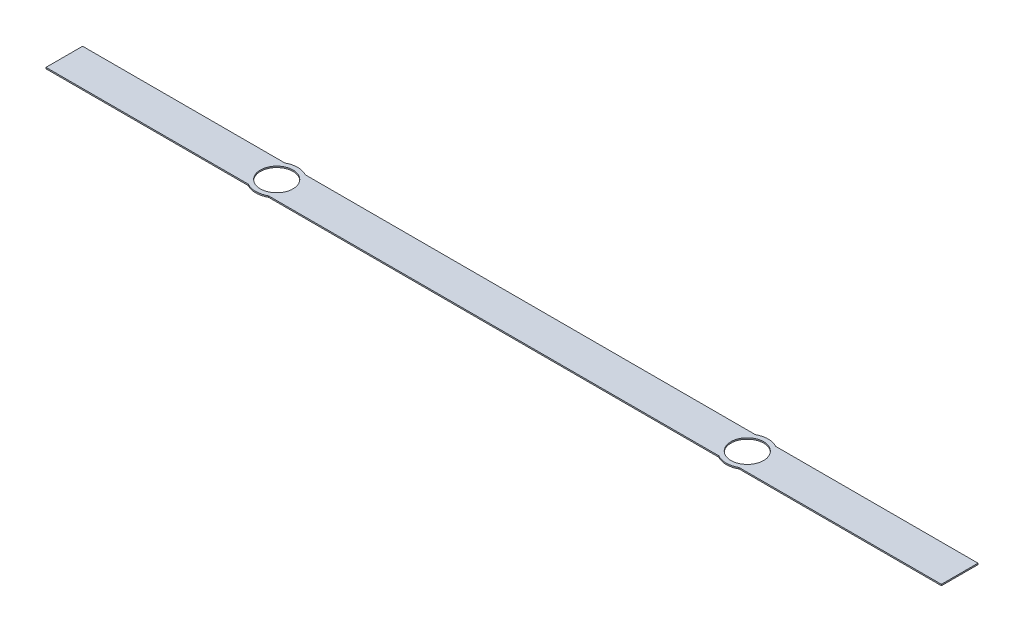
ISO-10303-21;
HEADER;
FILE_DESCRIPTION(('STEP AP214'),'2;1');
FILE_NAME('part.step','',(''),(''),'','','');
FILE_SCHEMA(('AUTOMOTIVE_DESIGN { 1 0 10303 214 1 1 1 1 }'));
ENDSEC;
DATA;
#1=APPLICATION_CONTEXT('core data for automotive mechanical design processes');
#2=APPLICATION_PROTOCOL_DEFINITION('international standard','automotive_design',2000,#1);
#3=PRODUCT_CONTEXT('',#1,'mechanical');
#4=PRODUCT('Part','Part','',(#3));
#5=PRODUCT_RELATED_PRODUCT_CATEGORY('part','',(#4));
#6=PRODUCT_DEFINITION_FORMATION('','',#4);
#7=PRODUCT_DEFINITION_CONTEXT('part definition',#1,'design');
#8=PRODUCT_DEFINITION('design','',#6,#7);
#9=PRODUCT_DEFINITION_SHAPE('','',#8);
#10=(LENGTH_UNIT() NAMED_UNIT(*) SI_UNIT(.MILLI.,.METRE.));
#11=(NAMED_UNIT(*) PLANE_ANGLE_UNIT() SI_UNIT($,.RADIAN.));
#12=(NAMED_UNIT(*) SI_UNIT($,.STERADIAN.) SOLID_ANGLE_UNIT());
#13=UNCERTAINTY_MEASURE_WITH_UNIT(LENGTH_MEASURE(1.E-05),#10,'distance_accuracy_value','');
#14=(GEOMETRIC_REPRESENTATION_CONTEXT(3) GLOBAL_UNCERTAINTY_ASSIGNED_CONTEXT((#13)) GLOBAL_UNIT_ASSIGNED_CONTEXT((#10,
#11,#12)) REPRESENTATION_CONTEXT('',''));
#15=CARTESIAN_POINT('',(0.,0.,0.));
#16=DIRECTION('',(0.,0.,1.));
#17=DIRECTION('',(1.,0.,0.));
#18=AXIS2_PLACEMENT_3D('',#15,#16,#17);
#19=CARTESIAN_POINT('',(-18.,0.1,0.));
#20=DIRECTION('',(0.,1.,0.));
#21=DIRECTION('',(0.,0.,1.));
#22=AXIS2_PLACEMENT_3D('',#19,#20,#21);
#23=PLANE('',#22);
#24=CARTESIAN_POINT('',(-18.,0.1,0.));
#25=DIRECTION('',(0.,1.,0.));
#26=DIRECTION('',(0.,0.,1.));
#27=AXIS2_PLACEMENT_3D('',#24,#25,#26);
#28=CIRCLE('',#27,1.25);
#29=CARTESIAN_POINT('',(-18.,0.1,1.25));
#30=VERTEX_POINT('',#29);
#31=EDGE_CURVE('E157',#30,#30,#28,.T.);
#32=ORIENTED_EDGE('',*,*,#31,.F.);
#33=EDGE_LOOP('',(#32));
#34=FACE_BOUND('',#33,.T.);
#35=DIRECTION('',(0.,0.,1.));
#36=VECTOR('',#35,1.);
#37=CARTESIAN_POINT('',(-34.25,0.1,-1.4));
#38=LINE('',#37,#36);
#39=CARTESIAN_POINT('',(-34.25,0.1,-1.4));
#40=VERTEX_POINT('',#39);
#41=CARTESIAN_POINT('',(-34.25,0.1,1.4));
#42=VERTEX_POINT('',#41);
#43=EDGE_CURVE('E176',#40,#42,#38,.T.);
#44=ORIENTED_EDGE('',*,*,#43,.T.);
#45=DIRECTION('',(1.,0.,0.));
#46=VECTOR('',#45,1.);
#47=CARTESIAN_POINT('',(-34.25,0.1,1.4));
#48=LINE('',#47,#46);
#49=CARTESIAN_POINT('',(-18.7745966692415,0.1,1.4));
#50=VERTEX_POINT('',#49);
#51=EDGE_CURVE('E104',#42,#50,#48,.T.);
#52=ORIENTED_EDGE('',*,*,#51,.T.);
#53=CARTESIAN_POINT('',(-18.,0.1,0.));
#54=DIRECTION('',(0.,1.,0.));
#55=DIRECTION('',(0.,0.,1.));
#56=AXIS2_PLACEMENT_3D('',#53,#54,#55);
#57=CIRCLE('',#56,1.6);
#58=CARTESIAN_POINT('',(-17.2254033307585,0.1,1.4));
#59=VERTEX_POINT('',#58);
#60=EDGE_CURVE('E203',#50,#59,#57,.T.);
#61=ORIENTED_EDGE('',*,*,#60,.T.);
#62=DIRECTION('',(1.,0.,0.));
#63=VECTOR('',#62,1.);
#64=CARTESIAN_POINT('',(-17.2254033307585,0.1,1.4));
#65=LINE('',#64,#63);
#66=CARTESIAN_POINT('',(17.2254033307585,0.1,1.4));
#67=VERTEX_POINT('',#66);
#68=EDGE_CURVE('E222',#59,#67,#65,.T.);
#69=ORIENTED_EDGE('',*,*,#68,.T.);
#70=CARTESIAN_POINT('',(18.,0.1,0.));
#71=DIRECTION('',(0.,1.,0.));
#72=DIRECTION('',(0.,0.,-1.));
#73=AXIS2_PLACEMENT_3D('',#70,#71,#72);
#74=CIRCLE('',#73,1.60000000000001);
#75=CARTESIAN_POINT('',(18.7745966692415,0.1,1.4));
#76=VERTEX_POINT('',#75);
#77=EDGE_CURVE('E219',#67,#76,#74,.T.);
#78=ORIENTED_EDGE('',*,*,#77,.T.);
#79=DIRECTION('',(1.,0.,0.));
#80=VECTOR('',#79,1.);
#81=CARTESIAN_POINT('',(18.7745966692415,0.1,1.4));
#82=LINE('',#81,#80);
#83=CARTESIAN_POINT('',(34.25,0.1,1.39999999999999));
#84=VERTEX_POINT('',#83);
#85=EDGE_CURVE('E221',#76,#84,#82,.T.);
#86=ORIENTED_EDGE('',*,*,#85,.T.);
#87=DIRECTION('',(0.,0.,-1.));
#88=VECTOR('',#87,1.);
#89=CARTESIAN_POINT('',(34.25,0.1,-1.39999999999999));
#90=LINE('',#89,#88);
#91=CARTESIAN_POINT('',(34.25,0.1,-1.39999999999999));
#92=VERTEX_POINT('',#91);
#93=EDGE_CURVE('E224',#84,#92,#90,.T.);
#94=ORIENTED_EDGE('',*,*,#93,.T.);
#95=DIRECTION('',(-1.,0.,0.));
#96=VECTOR('',#95,1.);
#97=CARTESIAN_POINT('',(18.7745966692415,0.1,-1.4));
#98=LINE('',#97,#96);
#99=CARTESIAN_POINT('',(18.7745966692415,0.1,-1.4));
#100=VERTEX_POINT('',#99);
#101=EDGE_CURVE('E230',#92,#100,#98,.T.);
#102=ORIENTED_EDGE('',*,*,#101,.T.);
#103=CARTESIAN_POINT('',(18.,0.1,0.));
#104=DIRECTION('',(0.,1.,0.));
#105=DIRECTION('',(0.,0.,-1.));
#106=AXIS2_PLACEMENT_3D('',#103,#104,#105);
#107=CIRCLE('',#106,1.6);
#108=CARTESIAN_POINT('',(17.2254033307585,0.1,-1.4));
#109=VERTEX_POINT('',#108);
#110=EDGE_CURVE('E135',#100,#109,#107,.T.);
#111=ORIENTED_EDGE('',*,*,#110,.T.);
#112=DIRECTION('',(-1.,0.,0.));
#113=VECTOR('',#112,1.);
#114=CARTESIAN_POINT('',(-17.2254033307585,0.1,-1.4));
#115=LINE('',#114,#113);
#116=CARTESIAN_POINT('',(-17.2254033307585,0.1,-1.4));
#117=VERTEX_POINT('',#116);
#118=EDGE_CURVE('E129',#109,#117,#115,.T.);
#119=ORIENTED_EDGE('',*,*,#118,.T.);
#120=CARTESIAN_POINT('',(-18.,0.1,0.));
#121=DIRECTION('',(0.,1.,0.));
#122=DIRECTION('',(0.,0.,1.));
#123=AXIS2_PLACEMENT_3D('',#120,#121,#122);
#124=CIRCLE('',#123,1.6);
#125=CARTESIAN_POINT('',(-18.7745966692415,0.1,-1.4));
#126=VERTEX_POINT('',#125);
#127=EDGE_CURVE('E133',#117,#126,#124,.T.);
#128=ORIENTED_EDGE('',*,*,#127,.T.);
#129=DIRECTION('',(-1.,0.,0.));
#130=VECTOR('',#129,1.);
#131=CARTESIAN_POINT('',(-34.25,0.1,-1.4));
#132=LINE('',#131,#130);
#133=EDGE_CURVE('E49',#126,#40,#132,.T.);
#134=ORIENTED_EDGE('',*,*,#133,.T.);
#135=EDGE_LOOP('',(#44,#52,#61,#69,#78,#86,#94,#102,#111,#119,#128,#134));
#136=FACE_BOUND('',#135,.T.);
#137=CARTESIAN_POINT('',(18.,0.1,0.));
#138=DIRECTION('',(0.,1.,0.));
#139=DIRECTION('',(0.,0.,-1.));
#140=AXIS2_PLACEMENT_3D('',#137,#138,#139);
#141=CIRCLE('',#140,1.25);
#142=CARTESIAN_POINT('',(18.,0.1,-1.25000000000001));
#143=VERTEX_POINT('',#142);
#144=EDGE_CURVE('E272',#143,#143,#141,.T.);
#145=ORIENTED_EDGE('',*,*,#144,.F.);
#146=EDGE_LOOP('',(#145));
#147=FACE_BOUND('',#146,.T.);
#148=ADVANCED_FACE('F32',(#34,#136,#147),#23,.T.);
#149=CARTESIAN_POINT('',(-18.,0.,0.));
#150=DIRECTION('',(0.,1.,0.));
#151=DIRECTION('',(0.,0.,1.));
#152=AXIS2_PLACEMENT_3D('',#149,#150,#151);
#153=PLANE('',#152);
#154=DIRECTION('',(0.,0.,1.));
#155=VECTOR('',#154,1.);
#156=CARTESIAN_POINT('',(-34.25,0.,-1.4));
#157=LINE('',#156,#155);
#158=CARTESIAN_POINT('',(-34.25,0.,-1.4));
#159=VERTEX_POINT('',#158);
#160=CARTESIAN_POINT('',(-34.25,0.,1.4));
#161=VERTEX_POINT('',#160);
#162=EDGE_CURVE('E153',#159,#161,#157,.T.);
#163=ORIENTED_EDGE('',*,*,#162,.F.);
#164=DIRECTION('',(-1.,0.,0.));
#165=VECTOR('',#164,1.);
#166=CARTESIAN_POINT('',(-34.25,0.,-1.4));
#167=LINE('',#166,#165);
#168=CARTESIAN_POINT('',(-18.7745966692415,0.,-1.4));
#169=VERTEX_POINT('',#168);
#170=EDGE_CURVE('E96',#169,#159,#167,.T.);
#171=ORIENTED_EDGE('',*,*,#170,.F.);
#172=CARTESIAN_POINT('',(-18.,0.,0.));
#173=DIRECTION('',(0.,1.,0.));
#174=DIRECTION('',(0.,0.,1.));
#175=AXIS2_PLACEMENT_3D('',#172,#173,#174);
#176=CIRCLE('',#175,1.6);
#177=CARTESIAN_POINT('',(-17.2254033307585,0.,-1.4));
#178=VERTEX_POINT('',#177);
#179=EDGE_CURVE('E90',#178,#169,#176,.T.);
#180=ORIENTED_EDGE('',*,*,#179,.F.);
#181=DIRECTION('',(-1.,0.,0.));
#182=VECTOR('',#181,1.);
#183=CARTESIAN_POINT('',(-17.2254033307585,0.,-1.4));
#184=LINE('',#183,#182);
#185=CARTESIAN_POINT('',(17.2254033307585,0.,-1.4));
#186=VERTEX_POINT('',#185);
#187=EDGE_CURVE('E143',#186,#178,#184,.T.);
#188=ORIENTED_EDGE('',*,*,#187,.F.);
#189=CARTESIAN_POINT('',(18.,0.,0.));
#190=DIRECTION('',(0.,1.,0.));
#191=DIRECTION('',(0.,0.,-1.));
#192=AXIS2_PLACEMENT_3D('',#189,#190,#191);
#193=CIRCLE('',#192,1.6);
#194=CARTESIAN_POINT('',(18.7745966692415,0.,-1.4));
#195=VERTEX_POINT('',#194);
#196=EDGE_CURVE('E171',#195,#186,#193,.T.);
#197=ORIENTED_EDGE('',*,*,#196,.F.);
#198=DIRECTION('',(-1.,0.,0.));
#199=VECTOR('',#198,1.);
#200=CARTESIAN_POINT('',(18.7745966692415,0.,-1.4));
#201=LINE('',#200,#199);
#202=CARTESIAN_POINT('',(34.25,0.,-1.39999999999999));
#203=VERTEX_POINT('',#202);
#204=EDGE_CURVE('E169',#203,#195,#201,.T.);
#205=ORIENTED_EDGE('',*,*,#204,.F.);
#206=DIRECTION('',(0.,0.,-1.));
#207=VECTOR('',#206,1.);
#208=CARTESIAN_POINT('',(34.25,0.,-1.39999999999999));
#209=LINE('',#208,#207);
#210=CARTESIAN_POINT('',(34.25,0.,1.39999999999999));
#211=VERTEX_POINT('',#210);
#212=EDGE_CURVE('E167',#211,#203,#209,.T.);
#213=ORIENTED_EDGE('',*,*,#212,.F.);
#214=DIRECTION('',(1.,0.,0.));
#215=VECTOR('',#214,1.);
#216=CARTESIAN_POINT('',(18.7745966692415,0.,1.4));
#217=LINE('',#216,#215);
#218=CARTESIAN_POINT('',(18.7745966692415,0.,1.4));
#219=VERTEX_POINT('',#218);
#220=EDGE_CURVE('E165',#219,#211,#217,.T.);
#221=ORIENTED_EDGE('',*,*,#220,.F.);
#222=CARTESIAN_POINT('',(18.,0.,0.));
#223=DIRECTION('',(0.,1.,0.));
#224=DIRECTION('',(0.,0.,-1.));
#225=AXIS2_PLACEMENT_3D('',#222,#223,#224);
#226=CIRCLE('',#225,1.60000000000001);
#227=CARTESIAN_POINT('',(17.2254033307585,0.,1.4));
#228=VERTEX_POINT('',#227);
#229=EDGE_CURVE('E163',#228,#219,#226,.T.);
#230=ORIENTED_EDGE('',*,*,#229,.F.);
#231=DIRECTION('',(1.,0.,0.));
#232=VECTOR('',#231,1.);
#233=CARTESIAN_POINT('',(-17.2254033307585,0.,1.4));
#234=LINE('',#233,#232);
#235=CARTESIAN_POINT('',(-17.2254033307585,0.,1.4));
#236=VERTEX_POINT('',#235);
#237=EDGE_CURVE('E161',#236,#228,#234,.T.);
#238=ORIENTED_EDGE('',*,*,#237,.F.);
#239=CARTESIAN_POINT('',(-18.,0.,0.));
#240=DIRECTION('',(0.,1.,0.));
#241=DIRECTION('',(0.,0.,1.));
#242=AXIS2_PLACEMENT_3D('',#239,#240,#241);
#243=CIRCLE('',#242,1.6);
#244=CARTESIAN_POINT('',(-18.7745966692415,0.,1.4));
#245=VERTEX_POINT('',#244);
#246=EDGE_CURVE('E159',#245,#236,#243,.T.);
#247=ORIENTED_EDGE('',*,*,#246,.F.);
#248=DIRECTION('',(1.,0.,0.));
#249=VECTOR('',#248,1.);
#250=CARTESIAN_POINT('',(-34.25,0.,1.4));
#251=LINE('',#250,#249);
#252=EDGE_CURVE('E156',#161,#245,#251,.T.);
#253=ORIENTED_EDGE('',*,*,#252,.F.);
#254=EDGE_LOOP('',(#163,#171,#180,#188,#197,#205,#213,#221,#230,#238,#247,#253));
#255=FACE_BOUND('',#254,.T.);
#256=CARTESIAN_POINT('',(-18.,0.,0.));
#257=DIRECTION('',(0.,1.,0.));
#258=DIRECTION('',(0.,0.,1.));
#259=AXIS2_PLACEMENT_3D('',#256,#257,#258);
#260=CIRCLE('',#259,1.25);
#261=CARTESIAN_POINT('',(-18.,0.,1.25));
#262=VERTEX_POINT('',#261);
#263=EDGE_CURVE('E278',#262,#262,#260,.T.);
#264=ORIENTED_EDGE('',*,*,#263,.T.);
#265=EDGE_LOOP('',(#264));
#266=FACE_BOUND('',#265,.T.);
#267=CARTESIAN_POINT('',(18.,0.,0.));
#268=DIRECTION('',(0.,1.,0.));
#269=DIRECTION('',(0.,0.,-1.));
#270=AXIS2_PLACEMENT_3D('',#267,#268,#269);
#271=CIRCLE('',#270,1.25);
#272=CARTESIAN_POINT('',(18.,0.,-1.25000000000001));
#273=VERTEX_POINT('',#272);
#274=EDGE_CURVE('E275',#273,#273,#271,.T.);
#275=ORIENTED_EDGE('',*,*,#274,.T.);
#276=EDGE_LOOP('',(#275));
#277=FACE_BOUND('',#276,.T.);
#278=ADVANCED_FACE('F207',(#255,#266,#277),#153,.F.);
#279=CARTESIAN_POINT('',(-34.25,0.1,-1.4));
#280=DIRECTION('',(1.,0.,0.));
#281=DIRECTION('',(0.,0.,-1.));
#282=AXIS2_PLACEMENT_3D('',#279,#280,#281);
#283=PLANE('',#282);
#284=ORIENTED_EDGE('',*,*,#162,.T.);
#285=DIRECTION('',(0.,-1.,0.));
#286=VECTOR('',#285,1.);
#287=CARTESIAN_POINT('',(-34.25,0.1,1.4));
#288=LINE('',#287,#286);
#289=EDGE_CURVE('E11',#42,#161,#288,.T.);
#290=ORIENTED_EDGE('',*,*,#289,.F.);
#291=ORIENTED_EDGE('',*,*,#43,.F.);
#292=DIRECTION('',(0.,-1.,0.));
#293=VECTOR('',#292,1.);
#294=CARTESIAN_POINT('',(-34.25,0.1,-1.4));
#295=LINE('',#294,#293);
#296=EDGE_CURVE('E149',#40,#159,#295,.T.);
#297=ORIENTED_EDGE('',*,*,#296,.T.);
#298=EDGE_LOOP('',(#284,#290,#291,#297));
#299=FACE_BOUND('',#298,.T.);
#300=ADVANCED_FACE('F34',(#299),#283,.F.);
#301=CARTESIAN_POINT('',(-34.25,0.1,1.4));
#302=DIRECTION('',(0.,0.,-1.));
#303=DIRECTION('',(-1.,0.,0.));
#304=AXIS2_PLACEMENT_3D('',#301,#302,#303);
#305=PLANE('',#304);
#306=ORIENTED_EDGE('',*,*,#252,.T.);
#307=DIRECTION('',(0.,-1.,0.));
#308=VECTOR('',#307,1.);
#309=CARTESIAN_POINT('',(-18.7745966692415,0.1,1.4));
#310=LINE('',#309,#308);
#311=EDGE_CURVE('E41',#50,#245,#310,.T.);
#312=ORIENTED_EDGE('',*,*,#311,.F.);
#313=ORIENTED_EDGE('',*,*,#51,.F.);
#314=ORIENTED_EDGE('',*,*,#289,.T.);
#315=EDGE_LOOP('',(#306,#312,#313,#314));
#316=FACE_BOUND('',#315,.T.);
#317=ADVANCED_FACE('F371',(#316),#305,.F.);
#318=CARTESIAN_POINT('',(-18.,0.1,0.));
#319=DIRECTION('',(0.,-1.,0.));
#320=DIRECTION('',(0.,0.,-1.));
#321=AXIS2_PLACEMENT_3D('',#318,#319,#320);
#322=CYLINDRICAL_SURFACE('',#321,1.6);
#323=ORIENTED_EDGE('',*,*,#246,.T.);
#324=DIRECTION('',(0.,-1.,0.));
#325=VECTOR('',#324,1.);
#326=CARTESIAN_POINT('',(-17.2254033307585,0.1,1.4));
#327=LINE('',#326,#325);
#328=EDGE_CURVE('E195',#59,#236,#327,.T.);
#329=ORIENTED_EDGE('',*,*,#328,.F.);
#330=ORIENTED_EDGE('',*,*,#60,.F.);
#331=ORIENTED_EDGE('',*,*,#311,.T.);
#332=EDGE_LOOP('',(#323,#329,#330,#331));
#333=FACE_BOUND('',#332,.T.);
#334=ADVANCED_FACE('F201',(#333),#322,.T.);
#335=CARTESIAN_POINT('',(-17.2254033307585,0.1,1.4));
#336=DIRECTION('',(0.,0.,-1.));
#337=DIRECTION('',(-1.,0.,0.));
#338=AXIS2_PLACEMENT_3D('',#335,#336,#337);
#339=PLANE('',#338);
#340=ORIENTED_EDGE('',*,*,#237,.T.);
#341=DIRECTION('',(0.,-1.,0.));
#342=VECTOR('',#341,1.);
#343=CARTESIAN_POINT('',(17.2254033307585,0.1,1.4));
#344=LINE('',#343,#342);
#345=EDGE_CURVE('E192',#67,#228,#344,.T.);
#346=ORIENTED_EDGE('',*,*,#345,.F.);
#347=ORIENTED_EDGE('',*,*,#68,.F.);
#348=ORIENTED_EDGE('',*,*,#328,.T.);
#349=EDGE_LOOP('',(#340,#346,#347,#348));
#350=FACE_BOUND('',#349,.T.);
#351=ADVANCED_FACE('F213',(#350),#339,.F.);
#352=CARTESIAN_POINT('',(18.,0.1,0.));
#353=DIRECTION('',(0.,-1.,0.));
#354=DIRECTION('',(0.,0.,-1.));
#355=AXIS2_PLACEMENT_3D('',#352,#353,#354);
#356=CYLINDRICAL_SURFACE('',#355,1.60000000000001);
#357=ORIENTED_EDGE('',*,*,#229,.T.);
#358=DIRECTION('',(0.,-1.,0.));
#359=VECTOR('',#358,1.);
#360=CARTESIAN_POINT('',(18.7745966692415,0.1,1.4));
#361=LINE('',#360,#359);
#362=EDGE_CURVE('E189',#76,#219,#361,.T.);
#363=ORIENTED_EDGE('',*,*,#362,.F.);
#364=ORIENTED_EDGE('',*,*,#77,.F.);
#365=ORIENTED_EDGE('',*,*,#345,.T.);
#366=EDGE_LOOP('',(#357,#363,#364,#365));
#367=FACE_BOUND('',#366,.T.);
#368=ADVANCED_FACE('F217',(#367),#356,.T.);
#369=CARTESIAN_POINT('',(18.7745966692415,0.1,1.4));
#370=DIRECTION('',(0.,0.,-1.));
#371=DIRECTION('',(-1.,0.,0.));
#372=AXIS2_PLACEMENT_3D('',#369,#370,#371);
#373=PLANE('',#372);
#374=ORIENTED_EDGE('',*,*,#220,.T.);
#375=DIRECTION('',(0.,-1.,0.));
#376=VECTOR('',#375,1.);
#377=CARTESIAN_POINT('',(34.25,0.1,1.39999999999999));
#378=LINE('',#377,#376);
#379=EDGE_CURVE('E186',#84,#211,#378,.T.);
#380=ORIENTED_EDGE('',*,*,#379,.F.);
#381=ORIENTED_EDGE('',*,*,#85,.F.);
#382=ORIENTED_EDGE('',*,*,#362,.T.);
#383=EDGE_LOOP('',(#374,#380,#381,#382));
#384=FACE_BOUND('',#383,.T.);
#385=ADVANCED_FACE('F336',(#384),#373,.F.);
#386=CARTESIAN_POINT('',(34.25,0.1,-1.39999999999999));
#387=DIRECTION('',(-1.,0.,0.));
#388=DIRECTION('',(0.,0.,1.));
#389=AXIS2_PLACEMENT_3D('',#386,#387,#388);
#390=PLANE('',#389);
#391=ORIENTED_EDGE('',*,*,#212,.T.);
#392=DIRECTION('',(0.,-1.,0.));
#393=VECTOR('',#392,1.);
#394=CARTESIAN_POINT('',(34.25,0.1,-1.39999999999999));
#395=LINE('',#394,#393);
#396=EDGE_CURVE('E183',#92,#203,#395,.T.);
#397=ORIENTED_EDGE('',*,*,#396,.F.);
#398=ORIENTED_EDGE('',*,*,#93,.F.);
#399=ORIENTED_EDGE('',*,*,#379,.T.);
#400=EDGE_LOOP('',(#391,#397,#398,#399));
#401=FACE_BOUND('',#400,.T.);
#402=ADVANCED_FACE('F327',(#401),#390,.F.);
#403=CARTESIAN_POINT('',(18.7745966692415,0.1,-1.4));
#404=DIRECTION('',(0.,0.,1.));
#405=DIRECTION('',(1.,0.,0.));
#406=AXIS2_PLACEMENT_3D('',#403,#404,#405);
#407=PLANE('',#406);
#408=ORIENTED_EDGE('',*,*,#204,.T.);
#409=DIRECTION('',(0.,-1.,0.));
#410=VECTOR('',#409,1.);
#411=CARTESIAN_POINT('',(18.7745966692415,0.1,-1.4));
#412=LINE('',#411,#410);
#413=EDGE_CURVE('E180',#100,#195,#412,.T.);
#414=ORIENTED_EDGE('',*,*,#413,.F.);
#415=ORIENTED_EDGE('',*,*,#101,.F.);
#416=ORIENTED_EDGE('',*,*,#396,.T.);
#417=EDGE_LOOP('',(#408,#414,#415,#416));
#418=FACE_BOUND('',#417,.T.);
#419=ADVANCED_FACE('F236',(#418),#407,.F.);
#420=CARTESIAN_POINT('',(18.,0.1,0.));
#421=DIRECTION('',(0.,-1.,0.));
#422=DIRECTION('',(0.,0.,-1.));
#423=AXIS2_PLACEMENT_3D('',#420,#421,#422);
#424=CYLINDRICAL_SURFACE('',#423,1.6);
#425=ORIENTED_EDGE('',*,*,#196,.T.);
#426=DIRECTION('',(0.,-1.,0.));
#427=VECTOR('',#426,1.);
#428=CARTESIAN_POINT('',(17.2254033307585,0.1,-1.4));
#429=LINE('',#428,#427);
#430=EDGE_CURVE('E144',#109,#186,#429,.T.);
#431=ORIENTED_EDGE('',*,*,#430,.F.);
#432=ORIENTED_EDGE('',*,*,#110,.F.);
#433=ORIENTED_EDGE('',*,*,#413,.T.);
#434=EDGE_LOOP('',(#425,#431,#432,#433));
#435=FACE_BOUND('',#434,.T.);
#436=ADVANCED_FACE('F240',(#435),#424,.T.);
#437=CARTESIAN_POINT('',(-17.2254033307585,0.1,-1.4));
#438=DIRECTION('',(0.,0.,1.));
#439=DIRECTION('',(1.,0.,0.));
#440=AXIS2_PLACEMENT_3D('',#437,#438,#439);
#441=PLANE('',#440);
#442=ORIENTED_EDGE('',*,*,#187,.T.);
#443=DIRECTION('',(0.,-1.,0.));
#444=VECTOR('',#443,1.);
#445=CARTESIAN_POINT('',(-17.2254033307585,0.1,-1.4));
#446=LINE('',#445,#444);
#447=EDGE_CURVE('E140',#117,#178,#446,.T.);
#448=ORIENTED_EDGE('',*,*,#447,.F.);
#449=ORIENTED_EDGE('',*,*,#118,.F.);
#450=ORIENTED_EDGE('',*,*,#430,.T.);
#451=EDGE_LOOP('',(#442,#448,#449,#450));
#452=FACE_BOUND('',#451,.T.);
#453=ADVANCED_FACE('F141',(#452),#441,.F.);
#454=CARTESIAN_POINT('',(-18.,0.1,0.));
#455=DIRECTION('',(0.,-1.,0.));
#456=DIRECTION('',(0.,0.,-1.));
#457=AXIS2_PLACEMENT_3D('',#454,#455,#456);
#458=CYLINDRICAL_SURFACE('',#457,1.6);
#459=ORIENTED_EDGE('',*,*,#179,.T.);
#460=DIRECTION('',(0.,-1.,0.));
#461=VECTOR('',#460,1.);
#462=CARTESIAN_POINT('',(-18.7745966692415,0.1,-1.4));
#463=LINE('',#462,#461);
#464=EDGE_CURVE('E145',#126,#169,#463,.T.);
#465=ORIENTED_EDGE('',*,*,#464,.F.);
#466=ORIENTED_EDGE('',*,*,#127,.F.);
#467=ORIENTED_EDGE('',*,*,#447,.T.);
#468=EDGE_LOOP('',(#459,#465,#466,#467));
#469=FACE_BOUND('',#468,.T.);
#470=ADVANCED_FACE('F147',(#469),#458,.T.);
#471=CARTESIAN_POINT('',(-34.25,0.1,-1.4));
#472=DIRECTION('',(0.,0.,1.));
#473=DIRECTION('',(1.,0.,0.));
#474=AXIS2_PLACEMENT_3D('',#471,#472,#473);
#475=PLANE('',#474);
#476=ORIENTED_EDGE('',*,*,#170,.T.);
#477=ORIENTED_EDGE('',*,*,#296,.F.);
#478=ORIENTED_EDGE('',*,*,#133,.F.);
#479=ORIENTED_EDGE('',*,*,#464,.T.);
#480=EDGE_LOOP('',(#476,#477,#478,#479));
#481=FACE_BOUND('',#480,.T.);
#482=ADVANCED_FACE('F244',(#481),#475,.F.);
#483=CARTESIAN_POINT('',(-18.,0.1,0.));
#484=DIRECTION('',(0.,-1.,0.));
#485=DIRECTION('',(0.,0.,-1.));
#486=AXIS2_PLACEMENT_3D('',#483,#484,#485);
#487=CYLINDRICAL_SURFACE('',#486,1.25);
#488=ORIENTED_EDGE('',*,*,#31,.T.);
#489=EDGE_LOOP('',(#488));
#490=FACE_BOUND('',#489,.T.);
#491=ORIENTED_EDGE('',*,*,#263,.F.);
#492=EDGE_LOOP('',(#491));
#493=FACE_BOUND('',#492,.T.);
#494=ADVANCED_FACE('F246',(#490,#493),#487,.F.);
#495=CARTESIAN_POINT('',(18.,0.1,0.));
#496=DIRECTION('',(0.,-1.,0.));
#497=DIRECTION('',(0.,0.,-1.));
#498=AXIS2_PLACEMENT_3D('',#495,#496,#497);
#499=CYLINDRICAL_SURFACE('',#498,1.25);
#500=ORIENTED_EDGE('',*,*,#144,.T.);
#501=EDGE_LOOP('',(#500));
#502=FACE_BOUND('',#501,.T.);
#503=ORIENTED_EDGE('',*,*,#274,.F.);
#504=EDGE_LOOP('',(#503));
#505=FACE_BOUND('',#504,.T.);
#506=ADVANCED_FACE('F252',(#502,#505),#499,.F.);
#507=CLOSED_SHELL('',(#148,#278,#300,#317,#334,#351,#368,#385,#402,#419,#436,#453,#470,#482,
#494,#506));
#508=MANIFOLD_SOLID_BREP('B2',#507);
#509=ADVANCED_BREP_SHAPE_REPRESENTATION('',(#18,#508),#14);
#510=SHAPE_DEFINITION_REPRESENTATION(#9,#509);
ENDSEC;
END-ISO-10303-21;
